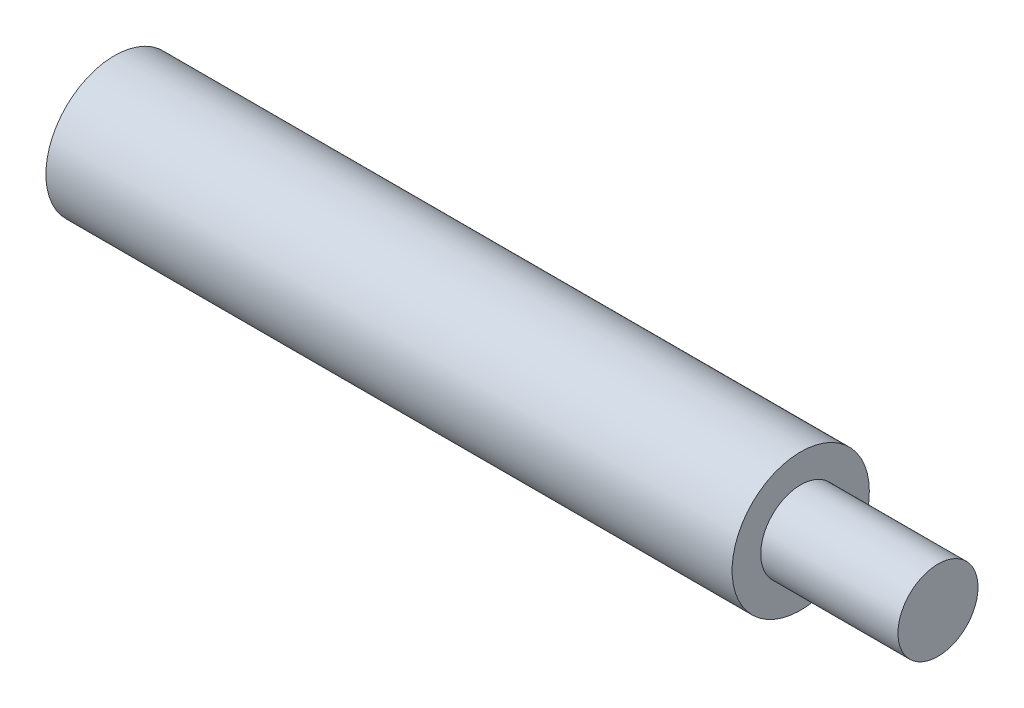
ISO-10303-21;
HEADER;
FILE_DESCRIPTION(('STEP AP214'),'2;1');
FILE_NAME('part.step','',(''),(''),'','','');
FILE_SCHEMA(('AUTOMOTIVE_DESIGN { 1 0 10303 214 1 1 1 1 }'));
ENDSEC;
DATA;
#1=APPLICATION_CONTEXT('core data for automotive mechanical design processes');
#2=APPLICATION_PROTOCOL_DEFINITION('international standard','automotive_design',2000,#1);
#3=PRODUCT_CONTEXT('',#1,'mechanical');
#4=PRODUCT('Part','Part','',(#3));
#5=PRODUCT_RELATED_PRODUCT_CATEGORY('part','',(#4));
#6=PRODUCT_DEFINITION_FORMATION('','',#4);
#7=PRODUCT_DEFINITION_CONTEXT('part definition',#1,'design');
#8=PRODUCT_DEFINITION('design','',#6,#7);
#9=PRODUCT_DEFINITION_SHAPE('','',#8);
#10=(LENGTH_UNIT() NAMED_UNIT(*) SI_UNIT(.MILLI.,.METRE.));
#11=(NAMED_UNIT(*) PLANE_ANGLE_UNIT() SI_UNIT($,.RADIAN.));
#12=(NAMED_UNIT(*) SI_UNIT($,.STERADIAN.) SOLID_ANGLE_UNIT());
#13=UNCERTAINTY_MEASURE_WITH_UNIT(LENGTH_MEASURE(1.E-05),#10,'distance_accuracy_value','');
#14=(GEOMETRIC_REPRESENTATION_CONTEXT(3) GLOBAL_UNCERTAINTY_ASSIGNED_CONTEXT((#13)) GLOBAL_UNIT_ASSIGNED_CONTEXT((#10,
#11,#12)) REPRESENTATION_CONTEXT('',''));
#15=CARTESIAN_POINT('',(0.,0.,0.));
#16=DIRECTION('',(0.,0.,1.));
#17=DIRECTION('',(1.,0.,0.));
#18=AXIS2_PLACEMENT_3D('',#15,#16,#17);
#19=CARTESIAN_POINT('',(36.,20.,20.));
#20=DIRECTION('',(1.,0.,0.));
#21=DIRECTION('',(0.,0.,-1.));
#22=AXIS2_PLACEMENT_3D('',#19,#20,#21);
#23=PLANE('',#22);
#24=CARTESIAN_POINT('',(36.,20.,20.));
#25=DIRECTION('',(1.,0.,0.));
#26=DIRECTION('',(0.,0.,-1.));
#27=AXIS2_PLACEMENT_3D('',#24,#25,#26);
#28=CIRCLE('',#27,1.75);
#29=CARTESIAN_POINT('',(36.,20.,18.25));
#30=VERTEX_POINT('',#29);
#31=EDGE_CURVE('E17',#30,#30,#28,.F.);
#32=ORIENTED_EDGE('',*,*,#31,.F.);
#33=EDGE_LOOP('',(#32));
#34=FACE_BOUND('',#33,.T.);
#35=ADVANCED_FACE('F14',(#34),#23,.T.);
#36=CARTESIAN_POINT('',(33.,20.,20.));
#37=DIRECTION('',(1.,0.,0.));
#38=DIRECTION('',(0.,0.,-1.));
#39=AXIS2_PLACEMENT_3D('',#36,#37,#38);
#40=CYLINDRICAL_SURFACE('',#39,1.75);
#41=ORIENTED_EDGE('',*,*,#31,.T.);
#42=EDGE_LOOP('',(#41));
#43=FACE_BOUND('',#42,.T.);
#44=CARTESIAN_POINT('',(30.,20.,20.));
#45=DIRECTION('',(1.,0.,0.));
#46=DIRECTION('',(0.,0.,-1.));
#47=AXIS2_PLACEMENT_3D('',#44,#45,#46);
#48=CIRCLE('',#47,1.75);
#49=CARTESIAN_POINT('',(30.,20.,18.25));
#50=VERTEX_POINT('',#49);
#51=EDGE_CURVE('E26',#50,#50,#48,.F.);
#52=ORIENTED_EDGE('',*,*,#51,.F.);
#53=EDGE_LOOP('',(#52));
#54=FACE_BOUND('',#53,.T.);
#55=ADVANCED_FACE('F34',(#43,#54),#40,.T.);
#56=CARTESIAN_POINT('',(0.,20.,20.));
#57=DIRECTION('',(-1.,0.,0.));
#58=DIRECTION('',(0.,0.,1.));
#59=AXIS2_PLACEMENT_3D('',#56,#57,#58);
#60=PLANE('',#59);
#61=CARTESIAN_POINT('',(0.,20.,20.));
#62=DIRECTION('',(1.,0.,0.));
#63=DIRECTION('',(0.,0.,-1.));
#64=AXIS2_PLACEMENT_3D('',#61,#62,#63);
#65=CIRCLE('',#64,3.);
#66=CARTESIAN_POINT('',(0.,20.,17.));
#67=VERTEX_POINT('',#66);
#68=EDGE_CURVE('E21',#67,#67,#65,.T.);
#69=ORIENTED_EDGE('',*,*,#68,.F.);
#70=EDGE_LOOP('',(#69));
#71=FACE_BOUND('',#70,.T.);
#72=ADVANCED_FACE('F42',(#71),#60,.T.);
#73=CARTESIAN_POINT('',(30.,20.,20.));
#74=DIRECTION('',(1.,0.,0.));
#75=DIRECTION('',(0.,0.,-1.));
#76=AXIS2_PLACEMENT_3D('',#73,#74,#75);
#77=PLANE('',#76);
#78=ORIENTED_EDGE('',*,*,#51,.T.);
#79=EDGE_LOOP('',(#78));
#80=FACE_BOUND('',#79,.T.);
#81=CARTESIAN_POINT('',(30.,20.,20.));
#82=DIRECTION('',(1.,0.,0.));
#83=DIRECTION('',(0.,0.,-1.));
#84=AXIS2_PLACEMENT_3D('',#81,#82,#83);
#85=CIRCLE('',#84,3.);
#86=CARTESIAN_POINT('',(30.,20.,17.));
#87=VERTEX_POINT('',#86);
#88=EDGE_CURVE('E10',#87,#87,#85,.F.);
#89=ORIENTED_EDGE('',*,*,#88,.F.);
#90=EDGE_LOOP('',(#89));
#91=FACE_BOUND('',#90,.T.);
#92=ADVANCED_FACE('F45',(#80,#91),#77,.T.);
#93=CARTESIAN_POINT('',(15.,20.,20.));
#94=DIRECTION('',(1.,0.,0.));
#95=DIRECTION('',(0.,0.,-1.));
#96=AXIS2_PLACEMENT_3D('',#93,#94,#95);
#97=CYLINDRICAL_SURFACE('',#96,3.);
#98=ORIENTED_EDGE('',*,*,#88,.T.);
#99=EDGE_LOOP('',(#98));
#100=FACE_BOUND('',#99,.T.);
#101=ORIENTED_EDGE('',*,*,#68,.T.);
#102=EDGE_LOOP('',(#101));
#103=FACE_BOUND('',#102,.T.);
#104=ADVANCED_FACE('F43',(#100,#103),#97,.T.);
#105=CLOSED_SHELL('',(#35,#55,#72,#92,#104));
#106=MANIFOLD_SOLID_BREP('B1',#105);
#107=ADVANCED_BREP_SHAPE_REPRESENTATION('',(#18,#106),#14);
#108=SHAPE_DEFINITION_REPRESENTATION(#9,#107);
ENDSEC;
END-ISO-10303-21;
